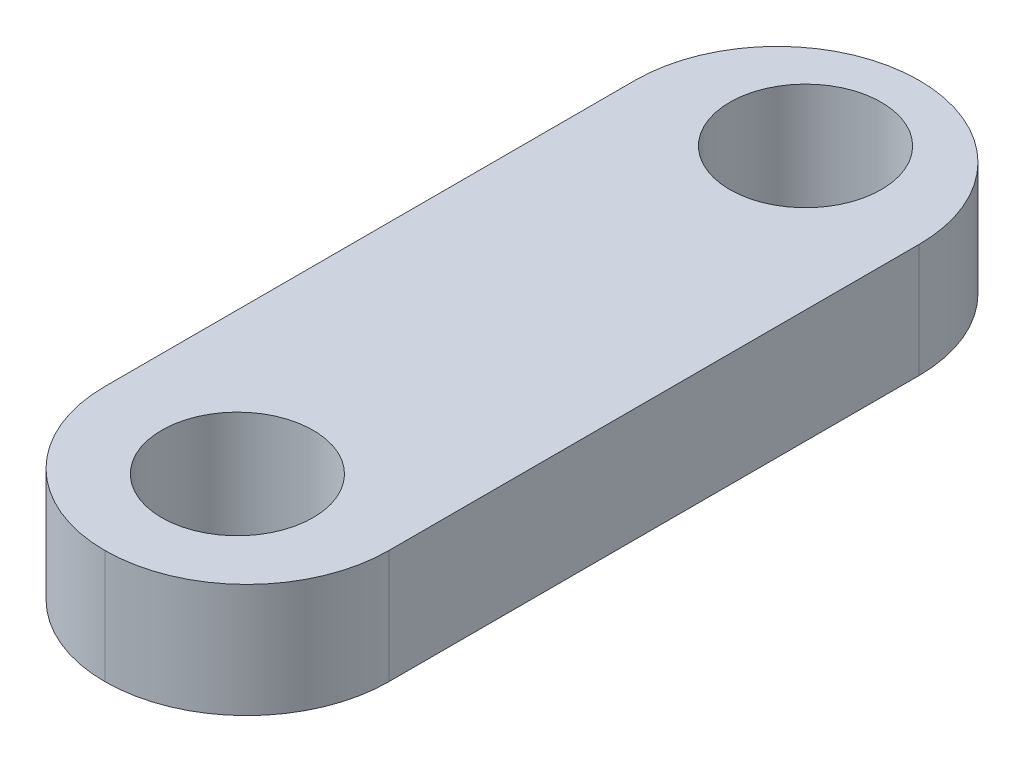
ISO-10303-21;
HEADER;
FILE_DESCRIPTION(('STEP AP214'),'2;1');
FILE_NAME('part.step','',(''),(''),'','','');
FILE_SCHEMA(('AUTOMOTIVE_DESIGN { 1 0 10303 214 1 1 1 1 }'));
ENDSEC;
DATA;
#1=APPLICATION_CONTEXT('core data for automotive mechanical design processes');
#2=APPLICATION_PROTOCOL_DEFINITION('international standard','automotive_design',2000,#1);
#3=PRODUCT_CONTEXT('',#1,'mechanical');
#4=PRODUCT('Part','Part','',(#3));
#5=PRODUCT_RELATED_PRODUCT_CATEGORY('part','',(#4));
#6=PRODUCT_DEFINITION_FORMATION('','',#4);
#7=PRODUCT_DEFINITION_CONTEXT('part definition',#1,'design');
#8=PRODUCT_DEFINITION('design','',#6,#7);
#9=PRODUCT_DEFINITION_SHAPE('','',#8);
#10=(LENGTH_UNIT() NAMED_UNIT(*) SI_UNIT(.MILLI.,.METRE.));
#11=(NAMED_UNIT(*) PLANE_ANGLE_UNIT() SI_UNIT($,.RADIAN.));
#12=(NAMED_UNIT(*) SI_UNIT($,.STERADIAN.) SOLID_ANGLE_UNIT());
#13=UNCERTAINTY_MEASURE_WITH_UNIT(LENGTH_MEASURE(1.E-05),#10,'distance_accuracy_value','');
#14=(GEOMETRIC_REPRESENTATION_CONTEXT(3) GLOBAL_UNCERTAINTY_ASSIGNED_CONTEXT((#13)) GLOBAL_UNIT_ASSIGNED_CONTEXT((#10,
#11,#12)) REPRESENTATION_CONTEXT('',''));
#15=CARTESIAN_POINT('',(0.,0.,0.));
#16=DIRECTION('',(0.,0.,1.));
#17=DIRECTION('',(1.,0.,0.));
#18=AXIS2_PLACEMENT_3D('',#15,#16,#17);
#19=CARTESIAN_POINT('',(0.,6.,0.));
#20=DIRECTION('',(1.,0.,0.));
#21=DIRECTION('',(0.,0.,-1.));
#22=AXIS2_PLACEMENT_3D('',#19,#20,#21);
#23=PLANE('',#22);
#24=DIRECTION('',(0.,0.,1.));
#25=VECTOR('',#24,1.);
#26=CARTESIAN_POINT('',(0.,0.,0.));
#27=LINE('',#26,#25);
#28=CARTESIAN_POINT('',(0.,0.,-35.5));
#29=VERTEX_POINT('',#28);
#30=CARTESIAN_POINT('',(0.,0.,-7.5));
#31=VERTEX_POINT('',#30);
#32=EDGE_CURVE('E94',#29,#31,#27,.T.);
#33=ORIENTED_EDGE('',*,*,#32,.T.);
#34=DIRECTION('',(0.,-1.,0.));
#35=VECTOR('',#34,1.);
#36=CARTESIAN_POINT('',(0.,6.,-7.5));
#37=LINE('',#36,#35);
#38=CARTESIAN_POINT('',(0.,6.,-7.5));
#39=VERTEX_POINT('',#38);
#40=EDGE_CURVE('E100',#31,#39,#37,.F.);
#41=ORIENTED_EDGE('',*,*,#40,.T.);
#42=DIRECTION('',(0.,0.,1.));
#43=VECTOR('',#42,1.);
#44=CARTESIAN_POINT('',(0.,6.,0.));
#45=LINE('',#44,#43);
#46=CARTESIAN_POINT('',(0.,6.,-35.5));
#47=VERTEX_POINT('',#46);
#48=EDGE_CURVE('E97',#47,#39,#45,.T.);
#49=ORIENTED_EDGE('',*,*,#48,.F.);
#50=DIRECTION('',(0.,-1.,0.));
#51=VECTOR('',#50,1.);
#52=CARTESIAN_POINT('',(0.,6.,-35.5));
#53=LINE('',#52,#51);
#54=EDGE_CURVE('E91',#47,#29,#53,.T.);
#55=ORIENTED_EDGE('',*,*,#54,.T.);
#56=EDGE_LOOP('',(#33,#41,#49,#55));
#57=FACE_BOUND('',#56,.T.);
#58=ADVANCED_FACE('F36',(#57),#23,.F.);
#59=CARTESIAN_POINT('',(15.,6.,0.));
#60=DIRECTION('',(-1.,0.,0.));
#61=DIRECTION('',(0.,0.,1.));
#62=AXIS2_PLACEMENT_3D('',#59,#60,#61);
#63=PLANE('',#62);
#64=DIRECTION('',(0.,0.,-1.));
#65=VECTOR('',#64,1.);
#66=CARTESIAN_POINT('',(15.,6.,0.));
#67=LINE('',#66,#65);
#68=CARTESIAN_POINT('',(15.,6.,-7.5));
#69=VERTEX_POINT('',#68);
#70=CARTESIAN_POINT('',(15.,6.,-35.5));
#71=VERTEX_POINT('',#70);
#72=EDGE_CURVE('E113',#69,#71,#67,.T.);
#73=ORIENTED_EDGE('',*,*,#72,.F.);
#74=DIRECTION('',(0.,-1.,0.));
#75=VECTOR('',#74,1.);
#76=CARTESIAN_POINT('',(15.,6.,-7.5));
#77=LINE('',#76,#75);
#78=CARTESIAN_POINT('',(15.,0.,-7.5));
#79=VERTEX_POINT('',#78);
#80=EDGE_CURVE('E11',#69,#79,#77,.T.);
#81=ORIENTED_EDGE('',*,*,#80,.T.);
#82=DIRECTION('',(0.,0.,-1.));
#83=VECTOR('',#82,1.);
#84=CARTESIAN_POINT('',(15.,0.,0.));
#85=LINE('',#84,#83);
#86=CARTESIAN_POINT('',(15.,0.,-35.5));
#87=VERTEX_POINT('',#86);
#88=EDGE_CURVE('E108',#79,#87,#85,.T.);
#89=ORIENTED_EDGE('',*,*,#88,.T.);
#90=DIRECTION('',(0.,-1.,0.));
#91=VECTOR('',#90,1.);
#92=CARTESIAN_POINT('',(15.,6.,-35.5));
#93=LINE('',#92,#91);
#94=EDGE_CURVE('E45',#87,#71,#93,.F.);
#95=ORIENTED_EDGE('',*,*,#94,.T.);
#96=EDGE_LOOP('',(#73,#81,#89,#95));
#97=FACE_BOUND('',#96,.T.);
#98=ADVANCED_FACE('F144',(#97),#63,.F.);
#99=CARTESIAN_POINT('',(0.,6.,0.));
#100=DIRECTION('',(0.,-1.,0.));
#101=DIRECTION('',(0.,0.,-1.));
#102=AXIS2_PLACEMENT_3D('',#99,#100,#101);
#103=PLANE('',#102);
#104=CARTESIAN_POINT('',(7.5,6.,-37.));
#105=DIRECTION('',(0.,1.,0.));
#106=DIRECTION('',(0.,0.,1.));
#107=AXIS2_PLACEMENT_3D('',#104,#105,#106);
#108=CIRCLE('',#107,4.);
#109=CARTESIAN_POINT('',(7.5,6.,-33.));
#110=VERTEX_POINT('',#109);
#111=EDGE_CURVE('E150',#110,#110,#108,.T.);
#112=ORIENTED_EDGE('',*,*,#111,.F.);
#113=EDGE_LOOP('',(#112));
#114=FACE_BOUND('',#113,.T.);
#115=CARTESIAN_POINT('',(7.5,6.,-7.));
#116=DIRECTION('',(0.,1.,0.));
#117=DIRECTION('',(0.,0.,1.));
#118=AXIS2_PLACEMENT_3D('',#115,#116,#117);
#119=CIRCLE('',#118,4.);
#120=CARTESIAN_POINT('',(7.5,6.,-3.));
#121=VERTEX_POINT('',#120);
#122=EDGE_CURVE('E136',#121,#121,#119,.T.);
#123=ORIENTED_EDGE('',*,*,#122,.F.);
#124=EDGE_LOOP('',(#123));
#125=FACE_BOUND('',#124,.T.);
#126=ORIENTED_EDGE('',*,*,#48,.T.);
#127=CARTESIAN_POINT('',(7.5,6.,-7.5));
#128=DIRECTION('',(0.,-1.,0.));
#129=DIRECTION('',(0.,0.,-1.));
#130=AXIS2_PLACEMENT_3D('',#127,#128,#129);
#131=CIRCLE('',#130,7.5);
#132=CARTESIAN_POINT('',(7.5,6.,0.));
#133=VERTEX_POINT('',#132);
#134=EDGE_CURVE('E128',#39,#133,#131,.F.);
#135=ORIENTED_EDGE('',*,*,#134,.T.);
#136=CARTESIAN_POINT('',(7.5,6.,-7.5));
#137=DIRECTION('',(0.,-1.,0.));
#138=DIRECTION('',(0.,0.,-1.));
#139=AXIS2_PLACEMENT_3D('',#136,#137,#138);
#140=CIRCLE('',#139,7.5);
#141=EDGE_CURVE('E126',#133,#69,#140,.F.);
#142=ORIENTED_EDGE('',*,*,#141,.T.);
#143=ORIENTED_EDGE('',*,*,#72,.T.);
#144=CARTESIAN_POINT('',(7.5,6.,-35.5));
#145=DIRECTION('',(0.,-1.,0.));
#146=DIRECTION('',(0.,0.,-1.));
#147=AXIS2_PLACEMENT_3D('',#144,#145,#146);
#148=CIRCLE('',#147,7.5);
#149=CARTESIAN_POINT('',(7.5,6.,-43.));
#150=VERTEX_POINT('',#149);
#151=EDGE_CURVE('E53',#71,#150,#148,.F.);
#152=ORIENTED_EDGE('',*,*,#151,.T.);
#153=CARTESIAN_POINT('',(7.5,6.,-35.5));
#154=DIRECTION('',(0.,-1.,0.));
#155=DIRECTION('',(0.,0.,-1.));
#156=AXIS2_PLACEMENT_3D('',#153,#154,#155);
#157=CIRCLE('',#156,7.5);
#158=EDGE_CURVE('E123',#150,#47,#157,.F.);
#159=ORIENTED_EDGE('',*,*,#158,.T.);
#160=EDGE_LOOP('',(#126,#135,#142,#143,#152,#159));
#161=FACE_BOUND('',#160,.T.);
#162=ADVANCED_FACE('F166',(#114,#125,#161),#103,.F.);
#163=CARTESIAN_POINT('',(0.,0.,0.));
#164=DIRECTION('',(0.,-1.,0.));
#165=DIRECTION('',(0.,0.,-1.));
#166=AXIS2_PLACEMENT_3D('',#163,#164,#165);
#167=PLANE('',#166);
#168=CARTESIAN_POINT('',(7.5,0.,-37.));
#169=DIRECTION('',(0.,1.,0.));
#170=DIRECTION('',(0.,0.,1.));
#171=AXIS2_PLACEMENT_3D('',#168,#169,#170);
#172=CIRCLE('',#171,4.);
#173=CARTESIAN_POINT('',(7.5,0.,-33.));
#174=VERTEX_POINT('',#173);
#175=EDGE_CURVE('E109',#174,#174,#172,.T.);
#176=ORIENTED_EDGE('',*,*,#175,.T.);
#177=EDGE_LOOP('',(#176));
#178=FACE_BOUND('',#177,.T.);
#179=CARTESIAN_POINT('',(7.5,0.,-7.));
#180=DIRECTION('',(0.,1.,0.));
#181=DIRECTION('',(0.,0.,1.));
#182=AXIS2_PLACEMENT_3D('',#179,#180,#181);
#183=CIRCLE('',#182,4.);
#184=CARTESIAN_POINT('',(7.5,0.,-3.));
#185=VERTEX_POINT('',#184);
#186=EDGE_CURVE('E132',#185,#185,#183,.T.);
#187=ORIENTED_EDGE('',*,*,#186,.T.);
#188=EDGE_LOOP('',(#187));
#189=FACE_BOUND('',#188,.T.);
#190=CARTESIAN_POINT('',(7.5,0.,-7.5));
#191=DIRECTION('',(0.,-1.,0.));
#192=DIRECTION('',(0.,0.,-1.));
#193=AXIS2_PLACEMENT_3D('',#190,#191,#192);
#194=CIRCLE('',#193,7.5);
#195=CARTESIAN_POINT('',(7.5,0.,0.));
#196=VERTEX_POINT('',#195);
#197=EDGE_CURVE('E115',#79,#196,#194,.T.);
#198=ORIENTED_EDGE('',*,*,#197,.T.);
#199=CARTESIAN_POINT('',(7.5,0.,-7.5));
#200=DIRECTION('',(0.,-1.,0.));
#201=DIRECTION('',(0.,0.,-1.));
#202=AXIS2_PLACEMENT_3D('',#199,#200,#201);
#203=CIRCLE('',#202,7.5);
#204=EDGE_CURVE('E101',#196,#31,#203,.T.);
#205=ORIENTED_EDGE('',*,*,#204,.T.);
#206=ORIENTED_EDGE('',*,*,#32,.F.);
#207=CARTESIAN_POINT('',(7.5,0.,-35.5));
#208=DIRECTION('',(0.,-1.,0.));
#209=DIRECTION('',(0.,0.,-1.));
#210=AXIS2_PLACEMENT_3D('',#207,#208,#209);
#211=CIRCLE('',#210,7.5);
#212=CARTESIAN_POINT('',(7.5,0.,-43.));
#213=VERTEX_POINT('',#212);
#214=EDGE_CURVE('E105',#29,#213,#211,.T.);
#215=ORIENTED_EDGE('',*,*,#214,.T.);
#216=CARTESIAN_POINT('',(7.5,0.,-35.5));
#217=DIRECTION('',(0.,-1.,0.));
#218=DIRECTION('',(0.,0.,-1.));
#219=AXIS2_PLACEMENT_3D('',#216,#217,#218);
#220=CIRCLE('',#219,7.5);
#221=EDGE_CURVE('E112',#213,#87,#220,.T.);
#222=ORIENTED_EDGE('',*,*,#221,.T.);
#223=ORIENTED_EDGE('',*,*,#88,.F.);
#224=EDGE_LOOP('',(#198,#205,#206,#215,#222,#223));
#225=FACE_BOUND('',#224,.T.);
#226=ADVANCED_FACE('F104',(#178,#189,#225),#167,.T.);
#227=CARTESIAN_POINT('',(7.5,0.,-7.));
#228=DIRECTION('',(0.,1.,0.));
#229=DIRECTION('',(0.,0.,1.));
#230=AXIS2_PLACEMENT_3D('',#227,#228,#229);
#231=CYLINDRICAL_SURFACE('',#230,4.);
#232=ORIENTED_EDGE('',*,*,#186,.F.);
#233=EDGE_LOOP('',(#232));
#234=FACE_BOUND('',#233,.T.);
#235=ORIENTED_EDGE('',*,*,#122,.T.);
#236=EDGE_LOOP('',(#235));
#237=FACE_BOUND('',#236,.T.);
#238=ADVANCED_FACE('F162',(#234,#237),#231,.F.);
#239=CARTESIAN_POINT('',(7.5,0.,-37.));
#240=DIRECTION('',(0.,1.,0.));
#241=DIRECTION('',(0.,0.,1.));
#242=AXIS2_PLACEMENT_3D('',#239,#240,#241);
#243=CYLINDRICAL_SURFACE('',#242,4.);
#244=ORIENTED_EDGE('',*,*,#175,.F.);
#245=EDGE_LOOP('',(#244));
#246=FACE_BOUND('',#245,.T.);
#247=ORIENTED_EDGE('',*,*,#111,.T.);
#248=EDGE_LOOP('',(#247));
#249=FACE_BOUND('',#248,.T.);
#250=ADVANCED_FACE('F158',(#246,#249),#243,.F.);
#251=CARTESIAN_POINT('',(7.5,6.,-7.5));
#252=DIRECTION('',(0.,-1.,0.));
#253=DIRECTION('',(0.,0.,-1.));
#254=AXIS2_PLACEMENT_3D('',#251,#252,#253);
#255=CYLINDRICAL_SURFACE('',#254,7.5);
#256=ORIENTED_EDGE('',*,*,#80,.F.);
#257=ORIENTED_EDGE('',*,*,#141,.F.);
#258=DIRECTION('',(0.,-1.,0.));
#259=VECTOR('',#258,1.);
#260=CARTESIAN_POINT('',(7.5,6.,0.));
#261=LINE('',#260,#259);
#262=EDGE_CURVE('E130',#196,#133,#261,.F.);
#263=ORIENTED_EDGE('',*,*,#262,.F.);
#264=ORIENTED_EDGE('',*,*,#197,.F.);
#265=EDGE_LOOP('',(#256,#257,#263,#264));
#266=FACE_BOUND('',#265,.T.);
#267=ADVANCED_FACE('F161',(#266),#255,.T.);
#268=CARTESIAN_POINT('',(7.5,6.,-7.5));
#269=DIRECTION('',(0.,-1.,0.));
#270=DIRECTION('',(0.,0.,-1.));
#271=AXIS2_PLACEMENT_3D('',#268,#269,#270);
#272=CYLINDRICAL_SURFACE('',#271,7.5);
#273=ORIENTED_EDGE('',*,*,#134,.F.);
#274=ORIENTED_EDGE('',*,*,#40,.F.);
#275=ORIENTED_EDGE('',*,*,#204,.F.);
#276=ORIENTED_EDGE('',*,*,#262,.T.);
#277=EDGE_LOOP('',(#273,#274,#275,#276));
#278=FACE_BOUND('',#277,.T.);
#279=ADVANCED_FACE('F187',(#278),#272,.T.);
#280=CARTESIAN_POINT('',(7.5,6.,-35.5));
#281=DIRECTION('',(0.,-1.,0.));
#282=DIRECTION('',(0.,0.,-1.));
#283=AXIS2_PLACEMENT_3D('',#280,#281,#282);
#284=CYLINDRICAL_SURFACE('',#283,7.5);
#285=ORIENTED_EDGE('',*,*,#54,.F.);
#286=ORIENTED_EDGE('',*,*,#158,.F.);
#287=DIRECTION('',(0.,-1.,0.));
#288=VECTOR('',#287,1.);
#289=CARTESIAN_POINT('',(7.5,6.,-43.));
#290=LINE('',#289,#288);
#291=EDGE_CURVE('E40',#213,#150,#290,.F.);
#292=ORIENTED_EDGE('',*,*,#291,.F.);
#293=ORIENTED_EDGE('',*,*,#214,.F.);
#294=EDGE_LOOP('',(#285,#286,#292,#293));
#295=FACE_BOUND('',#294,.T.);
#296=ADVANCED_FACE('F38',(#295),#284,.T.);
#297=CARTESIAN_POINT('',(7.5,6.,-35.5));
#298=DIRECTION('',(0.,-1.,0.));
#299=DIRECTION('',(0.,0.,-1.));
#300=AXIS2_PLACEMENT_3D('',#297,#298,#299);
#301=CYLINDRICAL_SURFACE('',#300,7.5);
#302=ORIENTED_EDGE('',*,*,#151,.F.);
#303=ORIENTED_EDGE('',*,*,#94,.F.);
#304=ORIENTED_EDGE('',*,*,#221,.F.);
#305=ORIENTED_EDGE('',*,*,#291,.T.);
#306=EDGE_LOOP('',(#302,#303,#304,#305));
#307=FACE_BOUND('',#306,.T.);
#308=ADVANCED_FACE('F138',(#307),#301,.T.);
#309=CLOSED_SHELL('',(#58,#98,#162,#226,#238,#250,#267,#279,#296,#308));
#310=MANIFOLD_SOLID_BREP('B2',#309);
#311=ADVANCED_BREP_SHAPE_REPRESENTATION('',(#18,#310),#14);
#312=SHAPE_DEFINITION_REPRESENTATION(#9,#311);
ENDSEC;
END-ISO-10303-21;
